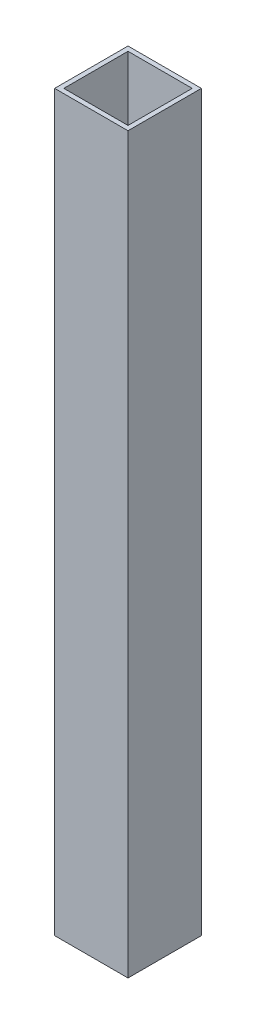
ISO-10303-21;
HEADER;
FILE_DESCRIPTION(('STEP AP214'),'2;1');
FILE_NAME('part.step','',(''),(''),'','','');
FILE_SCHEMA(('AUTOMOTIVE_DESIGN { 1 0 10303 214 1 1 1 1 }'));
ENDSEC;
DATA;
#1=APPLICATION_CONTEXT('core data for automotive mechanical design processes');
#2=APPLICATION_PROTOCOL_DEFINITION('international standard','automotive_design',2000,#1);
#3=PRODUCT_CONTEXT('',#1,'mechanical');
#4=PRODUCT('Part','Part','',(#3));
#5=PRODUCT_RELATED_PRODUCT_CATEGORY('part','',(#4));
#6=PRODUCT_DEFINITION_FORMATION('','',#4);
#7=PRODUCT_DEFINITION_CONTEXT('part definition',#1,'design');
#8=PRODUCT_DEFINITION('design','',#6,#7);
#9=PRODUCT_DEFINITION_SHAPE('','',#8);
#10=(LENGTH_UNIT() NAMED_UNIT(*) SI_UNIT(.MILLI.,.METRE.));
#11=(NAMED_UNIT(*) PLANE_ANGLE_UNIT() SI_UNIT($,.RADIAN.));
#12=(NAMED_UNIT(*) SI_UNIT($,.STERADIAN.) SOLID_ANGLE_UNIT());
#13=UNCERTAINTY_MEASURE_WITH_UNIT(LENGTH_MEASURE(1.E-05),#10,'distance_accuracy_value','');
#14=(GEOMETRIC_REPRESENTATION_CONTEXT(3) GLOBAL_UNCERTAINTY_ASSIGNED_CONTEXT((#13)) GLOBAL_UNIT_ASSIGNED_CONTEXT((#10,
#11,#12)) REPRESENTATION_CONTEXT('',''));
#15=CARTESIAN_POINT('',(0.,0.,0.));
#16=DIRECTION('',(0.,0.,1.));
#17=DIRECTION('',(1.,0.,0.));
#18=AXIS2_PLACEMENT_3D('',#15,#16,#17);
#19=CARTESIAN_POINT('',(0.,254.,0.));
#20=DIRECTION('',(0.,-1.,0.));
#21=DIRECTION('',(0.,0.,-1.));
#22=AXIS2_PLACEMENT_3D('',#19,#20,#21);
#23=PLANE('',#22);
#24=DIRECTION('',(0.,0.,1.));
#25=VECTOR('',#24,1.);
#26=CARTESIAN_POINT('',(-12.7,254.,-12.7));
#27=LINE('',#26,#25);
#28=CARTESIAN_POINT('',(-12.7,254.,-12.7));
#29=VERTEX_POINT('',#28);
#30=CARTESIAN_POINT('',(-12.7,254.,12.7));
#31=VERTEX_POINT('',#30);
#32=EDGE_CURVE('E142',#29,#31,#27,.T.);
#33=ORIENTED_EDGE('',*,*,#32,.T.);
#34=DIRECTION('',(1.,0.,0.));
#35=VECTOR('',#34,1.);
#36=CARTESIAN_POINT('',(12.7,254.,12.7));
#37=LINE('',#36,#35);
#38=CARTESIAN_POINT('',(12.7,254.,12.7));
#39=VERTEX_POINT('',#38);
#40=EDGE_CURVE('E145',#31,#39,#37,.T.);
#41=ORIENTED_EDGE('',*,*,#40,.T.);
#42=DIRECTION('',(0.,0.,-1.));
#43=VECTOR('',#42,1.);
#44=CARTESIAN_POINT('',(12.7,254.,-12.7));
#45=LINE('',#44,#43);
#46=CARTESIAN_POINT('',(12.7,254.,-12.7));
#47=VERTEX_POINT('',#46);
#48=EDGE_CURVE('E148',#39,#47,#45,.T.);
#49=ORIENTED_EDGE('',*,*,#48,.T.);
#50=DIRECTION('',(-1.,0.,0.));
#51=VECTOR('',#50,1.);
#52=CARTESIAN_POINT('',(12.7,254.,-12.7));
#53=LINE('',#52,#51);
#54=EDGE_CURVE('E150',#47,#29,#53,.T.);
#55=ORIENTED_EDGE('',*,*,#54,.T.);
#56=EDGE_LOOP('',(#33,#41,#49,#55));
#57=FACE_BOUND('',#56,.T.);
#58=DIRECTION('',(0.,0.,1.));
#59=VECTOR('',#58,1.);
#60=CARTESIAN_POINT('',(-11.1125,254.,11.1125));
#61=LINE('',#60,#59);
#62=CARTESIAN_POINT('',(-11.1125,254.,-11.1125));
#63=VERTEX_POINT('',#62);
#64=CARTESIAN_POINT('',(-11.1125,254.,11.1125));
#65=VERTEX_POINT('',#64);
#66=EDGE_CURVE('E106',#63,#65,#61,.T.);
#67=ORIENTED_EDGE('',*,*,#66,.F.);
#68=DIRECTION('',(-1.,0.,0.));
#69=VECTOR('',#68,1.);
#70=CARTESIAN_POINT('',(11.1125,254.,-11.1125));
#71=LINE('',#70,#69);
#72=CARTESIAN_POINT('',(11.1125,254.,-11.1125));
#73=VERTEX_POINT('',#72);
#74=EDGE_CURVE('E128',#73,#63,#71,.T.);
#75=ORIENTED_EDGE('',*,*,#74,.F.);
#76=DIRECTION('',(0.,0.,-1.));
#77=VECTOR('',#76,1.);
#78=CARTESIAN_POINT('',(11.1125,254.,11.1125));
#79=LINE('',#78,#77);
#80=CARTESIAN_POINT('',(11.1125,254.,11.1125));
#81=VERTEX_POINT('',#80);
#82=EDGE_CURVE('E126',#81,#73,#79,.T.);
#83=ORIENTED_EDGE('',*,*,#82,.F.);
#84=DIRECTION('',(1.,0.,0.));
#85=VECTOR('',#84,1.);
#86=CARTESIAN_POINT('',(11.1125,254.,11.1125));
#87=LINE('',#86,#85);
#88=EDGE_CURVE('E114',#65,#81,#87,.T.);
#89=ORIENTED_EDGE('',*,*,#88,.F.);
#90=EDGE_LOOP('',(#67,#75,#83,#89));
#91=FACE_BOUND('',#90,.T.);
#92=ADVANCED_FACE('F41',(#57,#91),#23,.F.);
#93=CARTESIAN_POINT('',(0.,0.,0.));
#94=DIRECTION('',(0.,-1.,0.));
#95=DIRECTION('',(0.,0.,-1.));
#96=AXIS2_PLACEMENT_3D('',#93,#94,#95);
#97=PLANE('',#96);
#98=DIRECTION('',(0.,0.,1.));
#99=VECTOR('',#98,1.);
#100=CARTESIAN_POINT('',(-12.7,0.,-12.7));
#101=LINE('',#100,#99);
#102=CARTESIAN_POINT('',(-12.7,0.,-12.7));
#103=VERTEX_POINT('',#102);
#104=CARTESIAN_POINT('',(-12.7,0.,12.7));
#105=VERTEX_POINT('',#104);
#106=EDGE_CURVE('E122',#103,#105,#101,.T.);
#107=ORIENTED_EDGE('',*,*,#106,.F.);
#108=DIRECTION('',(-1.,0.,0.));
#109=VECTOR('',#108,1.);
#110=CARTESIAN_POINT('',(12.7,0.,-12.7));
#111=LINE('',#110,#109);
#112=CARTESIAN_POINT('',(12.7,0.,-12.7));
#113=VERTEX_POINT('',#112);
#114=EDGE_CURVE('E146',#113,#103,#111,.T.);
#115=ORIENTED_EDGE('',*,*,#114,.F.);
#116=DIRECTION('',(0.,0.,-1.));
#117=VECTOR('',#116,1.);
#118=CARTESIAN_POINT('',(12.7,0.,-12.7));
#119=LINE('',#118,#117);
#120=CARTESIAN_POINT('',(12.7,0.,12.7));
#121=VERTEX_POINT('',#120);
#122=EDGE_CURVE('E157',#121,#113,#119,.T.);
#123=ORIENTED_EDGE('',*,*,#122,.F.);
#124=DIRECTION('',(1.,0.,0.));
#125=VECTOR('',#124,1.);
#126=CARTESIAN_POINT('',(12.7,0.,12.7));
#127=LINE('',#126,#125);
#128=EDGE_CURVE('E155',#105,#121,#127,.T.);
#129=ORIENTED_EDGE('',*,*,#128,.F.);
#130=EDGE_LOOP('',(#107,#115,#123,#129));
#131=FACE_BOUND('',#130,.T.);
#132=DIRECTION('',(-1.,0.,0.));
#133=VECTOR('',#132,1.);
#134=CARTESIAN_POINT('',(11.1125,0.,-11.1125));
#135=LINE('',#134,#133);
#136=CARTESIAN_POINT('',(11.1125,0.,-11.1125));
#137=VERTEX_POINT('',#136);
#138=CARTESIAN_POINT('',(-11.1125,0.,-11.1125));
#139=VERTEX_POINT('',#138);
#140=EDGE_CURVE('E115',#137,#139,#135,.T.);
#141=ORIENTED_EDGE('',*,*,#140,.T.);
#142=DIRECTION('',(0.,0.,1.));
#143=VECTOR('',#142,1.);
#144=CARTESIAN_POINT('',(-11.1125,0.,11.1125));
#145=LINE('',#144,#143);
#146=CARTESIAN_POINT('',(-11.1125,0.,11.1125));
#147=VERTEX_POINT('',#146);
#148=EDGE_CURVE('E64',#139,#147,#145,.T.);
#149=ORIENTED_EDGE('',*,*,#148,.T.);
#150=DIRECTION('',(1.,0.,0.));
#151=VECTOR('',#150,1.);
#152=CARTESIAN_POINT('',(11.1125,0.,11.1125));
#153=LINE('',#152,#151);
#154=CARTESIAN_POINT('',(11.1125,0.,11.1125));
#155=VERTEX_POINT('',#154);
#156=EDGE_CURVE('E121',#147,#155,#153,.T.);
#157=ORIENTED_EDGE('',*,*,#156,.T.);
#158=DIRECTION('',(0.,0.,-1.));
#159=VECTOR('',#158,1.);
#160=CARTESIAN_POINT('',(11.1125,0.,11.1125));
#161=LINE('',#160,#159);
#162=EDGE_CURVE('E134',#155,#137,#161,.T.);
#163=ORIENTED_EDGE('',*,*,#162,.T.);
#164=EDGE_LOOP('',(#141,#149,#157,#163));
#165=FACE_BOUND('',#164,.T.);
#166=ADVANCED_FACE('F175',(#131,#165),#97,.T.);
#167=CARTESIAN_POINT('',(-12.7,254.,-12.7));
#168=DIRECTION('',(1.,0.,0.));
#169=DIRECTION('',(0.,0.,-1.));
#170=AXIS2_PLACEMENT_3D('',#167,#168,#169);
#171=PLANE('',#170);
#172=ORIENTED_EDGE('',*,*,#106,.T.);
#173=DIRECTION('',(0.,-1.,0.));
#174=VECTOR('',#173,1.);
#175=CARTESIAN_POINT('',(-12.7,254.,12.7));
#176=LINE('',#175,#174);
#177=EDGE_CURVE('E11',#31,#105,#176,.T.);
#178=ORIENTED_EDGE('',*,*,#177,.F.);
#179=ORIENTED_EDGE('',*,*,#32,.F.);
#180=DIRECTION('',(0.,-1.,0.));
#181=VECTOR('',#180,1.);
#182=CARTESIAN_POINT('',(-12.7,254.,-12.7));
#183=LINE('',#182,#181);
#184=EDGE_CURVE('E152',#29,#103,#183,.T.);
#185=ORIENTED_EDGE('',*,*,#184,.T.);
#186=EDGE_LOOP('',(#172,#178,#179,#185));
#187=FACE_BOUND('',#186,.T.);
#188=ADVANCED_FACE('F43',(#187),#171,.F.);
#189=CARTESIAN_POINT('',(12.7,254.,12.7));
#190=DIRECTION('',(0.,0.,-1.));
#191=DIRECTION('',(-1.,0.,0.));
#192=AXIS2_PLACEMENT_3D('',#189,#190,#191);
#193=PLANE('',#192);
#194=ORIENTED_EDGE('',*,*,#128,.T.);
#195=DIRECTION('',(0.,-1.,0.));
#196=VECTOR('',#195,1.);
#197=CARTESIAN_POINT('',(12.7,254.,12.7));
#198=LINE('',#197,#196);
#199=EDGE_CURVE('E49',#39,#121,#198,.T.);
#200=ORIENTED_EDGE('',*,*,#199,.F.);
#201=ORIENTED_EDGE('',*,*,#40,.F.);
#202=ORIENTED_EDGE('',*,*,#177,.T.);
#203=EDGE_LOOP('',(#194,#200,#201,#202));
#204=FACE_BOUND('',#203,.T.);
#205=ADVANCED_FACE('F185',(#204),#193,.F.);
#206=CARTESIAN_POINT('',(12.7,254.,-12.7));
#207=DIRECTION('',(-1.,0.,0.));
#208=DIRECTION('',(0.,0.,1.));
#209=AXIS2_PLACEMENT_3D('',#206,#207,#208);
#210=PLANE('',#209);
#211=ORIENTED_EDGE('',*,*,#122,.T.);
#212=DIRECTION('',(0.,-1.,0.));
#213=VECTOR('',#212,1.);
#214=CARTESIAN_POINT('',(12.7,254.,-12.7));
#215=LINE('',#214,#213);
#216=EDGE_CURVE('E162',#47,#113,#215,.T.);
#217=ORIENTED_EDGE('',*,*,#216,.F.);
#218=ORIENTED_EDGE('',*,*,#48,.F.);
#219=ORIENTED_EDGE('',*,*,#199,.T.);
#220=EDGE_LOOP('',(#211,#217,#218,#219));
#221=FACE_BOUND('',#220,.T.);
#222=ADVANCED_FACE('F169',(#221),#210,.F.);
#223=CARTESIAN_POINT('',(12.7,254.,-12.7));
#224=DIRECTION('',(0.,0.,1.));
#225=DIRECTION('',(1.,0.,0.));
#226=AXIS2_PLACEMENT_3D('',#223,#224,#225);
#227=PLANE('',#226);
#228=ORIENTED_EDGE('',*,*,#114,.T.);
#229=ORIENTED_EDGE('',*,*,#184,.F.);
#230=ORIENTED_EDGE('',*,*,#54,.F.);
#231=ORIENTED_EDGE('',*,*,#216,.T.);
#232=EDGE_LOOP('',(#228,#229,#230,#231));
#233=FACE_BOUND('',#232,.T.);
#234=ADVANCED_FACE('F179',(#233),#227,.F.);
#235=CARTESIAN_POINT('',(-11.1125,254.,11.1125));
#236=DIRECTION('',(1.,0.,0.));
#237=DIRECTION('',(0.,0.,-1.));
#238=AXIS2_PLACEMENT_3D('',#235,#236,#237);
#239=PLANE('',#238);
#240=ORIENTED_EDGE('',*,*,#148,.F.);
#241=DIRECTION('',(0.,-1.,0.));
#242=VECTOR('',#241,1.);
#243=CARTESIAN_POINT('',(-11.1125,254.,-11.1125));
#244=LINE('',#243,#242);
#245=EDGE_CURVE('E110',#63,#139,#244,.T.);
#246=ORIENTED_EDGE('',*,*,#245,.F.);
#247=ORIENTED_EDGE('',*,*,#66,.T.);
#248=DIRECTION('',(0.,-1.,0.));
#249=VECTOR('',#248,1.);
#250=CARTESIAN_POINT('',(-11.1125,254.,11.1125));
#251=LINE('',#250,#249);
#252=EDGE_CURVE('E109',#65,#147,#251,.T.);
#253=ORIENTED_EDGE('',*,*,#252,.T.);
#254=EDGE_LOOP('',(#240,#246,#247,#253));
#255=FACE_BOUND('',#254,.T.);
#256=ADVANCED_FACE('F108',(#255),#239,.T.);
#257=CARTESIAN_POINT('',(11.1125,254.,11.1125));
#258=DIRECTION('',(0.,0.,-1.));
#259=DIRECTION('',(-1.,0.,0.));
#260=AXIS2_PLACEMENT_3D('',#257,#258,#259);
#261=PLANE('',#260);
#262=ORIENTED_EDGE('',*,*,#156,.F.);
#263=ORIENTED_EDGE('',*,*,#252,.F.);
#264=ORIENTED_EDGE('',*,*,#88,.T.);
#265=DIRECTION('',(0.,-1.,0.));
#266=VECTOR('',#265,1.);
#267=CARTESIAN_POINT('',(11.1125,254.,11.1125));
#268=LINE('',#267,#266);
#269=EDGE_CURVE('E123',#81,#155,#268,.T.);
#270=ORIENTED_EDGE('',*,*,#269,.T.);
#271=EDGE_LOOP('',(#262,#263,#264,#270));
#272=FACE_BOUND('',#271,.T.);
#273=ADVANCED_FACE('F118',(#272),#261,.T.);
#274=CARTESIAN_POINT('',(11.1125,254.,11.1125));
#275=DIRECTION('',(-1.,0.,0.));
#276=DIRECTION('',(0.,0.,1.));
#277=AXIS2_PLACEMENT_3D('',#274,#275,#276);
#278=PLANE('',#277);
#279=ORIENTED_EDGE('',*,*,#162,.F.);
#280=ORIENTED_EDGE('',*,*,#269,.F.);
#281=ORIENTED_EDGE('',*,*,#82,.T.);
#282=DIRECTION('',(0.,-1.,0.));
#283=VECTOR('',#282,1.);
#284=CARTESIAN_POINT('',(11.1125,254.,-11.1125));
#285=LINE('',#284,#283);
#286=EDGE_CURVE('E56',#73,#137,#285,.T.);
#287=ORIENTED_EDGE('',*,*,#286,.T.);
#288=EDGE_LOOP('',(#279,#280,#281,#287));
#289=FACE_BOUND('',#288,.T.);
#290=ADVANCED_FACE('F208',(#289),#278,.T.);
#291=CARTESIAN_POINT('',(11.1125,254.,-11.1125));
#292=DIRECTION('',(0.,0.,1.));
#293=DIRECTION('',(1.,0.,0.));
#294=AXIS2_PLACEMENT_3D('',#291,#292,#293);
#295=PLANE('',#294);
#296=ORIENTED_EDGE('',*,*,#140,.F.);
#297=ORIENTED_EDGE('',*,*,#286,.F.);
#298=ORIENTED_EDGE('',*,*,#74,.T.);
#299=ORIENTED_EDGE('',*,*,#245,.T.);
#300=EDGE_LOOP('',(#296,#297,#298,#299));
#301=FACE_BOUND('',#300,.T.);
#302=ADVANCED_FACE('F212',(#301),#295,.T.);
#303=CLOSED_SHELL('',(#92,#166,#188,#205,#222,#234,#256,#273,#290,#302));
#304=MANIFOLD_SOLID_BREP('B2',#303);
#305=ADVANCED_BREP_SHAPE_REPRESENTATION('',(#18,#304),#14);
#306=SHAPE_DEFINITION_REPRESENTATION(#9,#305);
ENDSEC;
END-ISO-10303-21;
